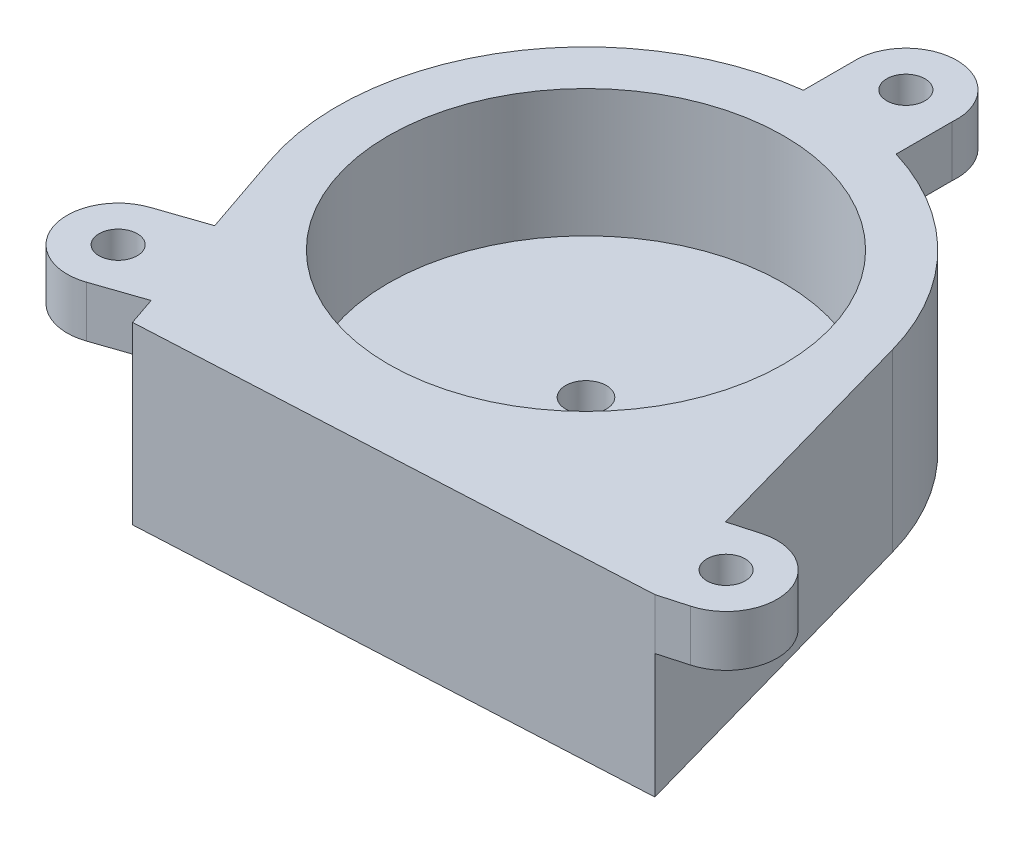
ISO-10303-21;
HEADER;
FILE_DESCRIPTION(('STEP AP214'),'2;1');
FILE_NAME('part.step','',(''),(''),'','','');
FILE_SCHEMA(('AUTOMOTIVE_DESIGN { 1 0 10303 214 1 1 1 1 }'));
ENDSEC;
DATA;
#1=APPLICATION_CONTEXT('core data for automotive mechanical design processes');
#2=APPLICATION_PROTOCOL_DEFINITION('international standard','automotive_design',2000,#1);
#3=PRODUCT_CONTEXT('',#1,'mechanical');
#4=PRODUCT('Part','Part','',(#3));
#5=PRODUCT_RELATED_PRODUCT_CATEGORY('part','',(#4));
#6=PRODUCT_DEFINITION_FORMATION('','',#4);
#7=PRODUCT_DEFINITION_CONTEXT('part definition',#1,'design');
#8=PRODUCT_DEFINITION('design','',#6,#7);
#9=PRODUCT_DEFINITION_SHAPE('','',#8);
#10=(LENGTH_UNIT() NAMED_UNIT(*) SI_UNIT(.MILLI.,.METRE.));
#11=(NAMED_UNIT(*) PLANE_ANGLE_UNIT() SI_UNIT($,.RADIAN.));
#12=(NAMED_UNIT(*) SI_UNIT($,.STERADIAN.) SOLID_ANGLE_UNIT());
#13=UNCERTAINTY_MEASURE_WITH_UNIT(LENGTH_MEASURE(1.E-05),#10,'distance_accuracy_value','');
#14=(GEOMETRIC_REPRESENTATION_CONTEXT(3) GLOBAL_UNCERTAINTY_ASSIGNED_CONTEXT((#13)) GLOBAL_UNIT_ASSIGNED_CONTEXT((#10,
#11,#12)) REPRESENTATION_CONTEXT('',''));
#15=CARTESIAN_POINT('',(0.,0.,0.));
#16=DIRECTION('',(0.,0.,1.));
#17=DIRECTION('',(1.,0.,0.));
#18=AXIS2_PLACEMENT_3D('',#15,#16,#17);
#19=CARTESIAN_POINT('',(0.,-6.254,0.));
#20=DIRECTION('',(0.,1.,0.));
#21=DIRECTION('',(0.,0.,1.));
#22=AXIS2_PLACEMENT_3D('',#19,#20,#21);
#23=CYLINDRICAL_SURFACE('',#22,1.6);
#24=CARTESIAN_POINT('',(0.,3.746,0.));
#25=DIRECTION('',(0.,1.,0.));
#26=DIRECTION('',(0.,0.,1.));
#27=AXIS2_PLACEMENT_3D('',#24,#25,#26);
#28=CIRCLE('',#27,1.6);
#29=CARTESIAN_POINT('',(0.,3.746,1.6));
#30=VERTEX_POINT('',#29);
#31=EDGE_CURVE('E382',#30,#30,#28,.T.);
#32=ORIENTED_EDGE('',*,*,#31,.T.);
#33=EDGE_LOOP('',(#32));
#34=FACE_BOUND('',#33,.T.);
#35=CARTESIAN_POINT('',(0.,0.746,0.));
#36=DIRECTION('',(0.,-1.,0.));
#37=DIRECTION('',(0.,0.,-1.));
#38=AXIS2_PLACEMENT_3D('',#35,#36,#37);
#39=CIRCLE('',#38,1.6);
#40=CARTESIAN_POINT('',(0.,0.746,-1.6));
#41=VERTEX_POINT('',#40);
#42=EDGE_CURVE('E42',#41,#41,#39,.F.);
#43=ORIENTED_EDGE('',*,*,#42,.F.);
#44=EDGE_LOOP('',(#43));
#45=FACE_BOUND('',#44,.T.);
#46=ADVANCED_FACE('F38',(#34,#45),#23,.F.);
#47=CARTESIAN_POINT('',(18.7686237282641,13.746,-5.29000178580058));
#48=DIRECTION('',(-0.962499402628868,0.,0.271283799625175));
#49=DIRECTION('',(0.271283799625175,0.,0.962499402628868));
#50=AXIS2_PLACEMENT_3D('',#47,#48,#49);
#51=PLANE('',#50);
#52=DIRECTION('',(0.,1.,0.));
#53=VECTOR('',#52,1.);
#54=CARTESIAN_POINT('',(23.921673943208,9.746,12.9927256032028));
#55=LINE('',#54,#53);
#56=CARTESIAN_POINT('',(23.921673943208,9.746,12.9927256032028));
#57=VERTEX_POINT('',#56);
#58=CARTESIAN_POINT('',(23.9216739432081,13.746,12.9927256032028));
#59=VERTEX_POINT('',#58);
#60=EDGE_CURVE('E348',#57,#59,#55,.T.);
#61=ORIENTED_EDGE('',*,*,#60,.F.);
#62=DIRECTION('',(-0.271283799625175,0.,-0.962499402628868));
#63=VECTOR('',#62,1.);
#64=CARTESIAN_POINT('',(18.7686237282641,9.746,-5.29000178580058));
#65=LINE('',#64,#63);
#66=CARTESIAN_POINT('',(26.0919443402095,9.746,20.6927208242338));
#67=VERTEX_POINT('',#66);
#68=EDGE_CURVE('E347',#67,#57,#65,.T.);
#69=ORIENTED_EDGE('',*,*,#68,.F.);
#70=DIRECTION('',(0.,-1.,0.));
#71=VECTOR('',#70,1.);
#72=CARTESIAN_POINT('',(26.0919443402095,13.746,20.6927208242338));
#73=LINE('',#72,#71);
#74=CARTESIAN_POINT('',(26.0919443402095,0.,20.6927208242338));
#75=VERTEX_POINT('',#74);
#76=EDGE_CURVE('E403',#67,#75,#73,.T.);
#77=ORIENTED_EDGE('',*,*,#76,.T.);
#78=DIRECTION('',(-0.271283799625175,0.,-0.962499402628868));
#79=VECTOR('',#78,1.);
#80=CARTESIAN_POINT('',(18.7686237282641,0.,-5.29000178580058));
#81=LINE('',#80,#79);
#82=CARTESIAN_POINT('',(18.7871117800502,0.,-5.22440723564889));
#83=VERTEX_POINT('',#82);
#84=EDGE_CURVE('E388',#75,#83,#81,.T.);
#85=ORIENTED_EDGE('',*,*,#84,.T.);
#86=DIRECTION('',(0.,-1.,0.));
#87=VECTOR('',#86,1.);
#88=CARTESIAN_POINT('',(18.7871117800502,13.746,-5.22440723564889));
#89=LINE('',#88,#87);
#90=CARTESIAN_POINT('',(18.7871117800502,13.746,-5.22440723564889));
#91=VERTEX_POINT('',#90);
#92=EDGE_CURVE('E328',#91,#83,#89,.T.);
#93=ORIENTED_EDGE('',*,*,#92,.F.);
#94=DIRECTION('',(-0.271283799625175,0.,-0.962499402628868));
#95=VECTOR('',#94,1.);
#96=CARTESIAN_POINT('',(18.7686237282641,13.746,-5.29000178580058));
#97=LINE('',#96,#95);
#98=EDGE_CURVE('E391',#59,#91,#97,.T.);
#99=ORIENTED_EDGE('',*,*,#98,.F.);
#100=EDGE_LOOP('',(#61,#69,#77,#85,#93,#99));
#101=FACE_BOUND('',#100,.T.);
#102=ADVANCED_FACE('F40',(#101),#51,.F.);
#103=CARTESIAN_POINT('',(0.,13.746,0.));
#104=DIRECTION('',(0.,-1.,0.));
#105=DIRECTION('',(0.,0.,-1.));
#106=AXIS2_PLACEMENT_3D('',#103,#104,#105);
#107=CYLINDRICAL_SURFACE('',#106,19.5);
#108=CARTESIAN_POINT('',(0.,9.746,0.));
#109=DIRECTION('',(0.,1.,0.));
#110=DIRECTION('',(0.,0.,1.));
#111=AXIS2_PLACEMENT_3D('',#108,#109,#110);
#112=CIRCLE('',#111,19.5);
#113=CARTESIAN_POINT('',(5.648,9.746,-18.6641393050952));
#114=VERTEX_POINT('',#113);
#115=CARTESIAN_POINT('',(-2.321,9.746,-19.361378024304));
#116=VERTEX_POINT('',#115);
#117=EDGE_CURVE('E247',#114,#116,#112,.T.);
#118=ORIENTED_EDGE('',*,*,#117,.F.);
#119=DIRECTION('',(0.,-1.,0.));
#120=VECTOR('',#119,1.);
#121=CARTESIAN_POINT('',(5.648,13.746,-18.6641393050952));
#122=LINE('',#121,#120);
#123=CARTESIAN_POINT('',(5.648,13.746,-18.6641393050952));
#124=VERTEX_POINT('',#123);
#125=EDGE_CURVE('E320',#114,#124,#122,.F.);
#126=ORIENTED_EDGE('',*,*,#125,.T.);
#127=CARTESIAN_POINT('',(0.,13.746,0.));
#128=DIRECTION('',(0.,1.,0.));
#129=DIRECTION('',(0.,0.,1.));
#130=AXIS2_PLACEMENT_3D('',#127,#128,#129);
#131=CIRCLE('',#130,19.5);
#132=EDGE_CURVE('E395',#91,#124,#131,.T.);
#133=ORIENTED_EDGE('',*,*,#132,.F.);
#134=ORIENTED_EDGE('',*,*,#92,.T.);
#135=CARTESIAN_POINT('',(0.,0.,0.));
#136=DIRECTION('',(0.,1.,0.));
#137=DIRECTION('',(0.,0.,1.));
#138=AXIS2_PLACEMENT_3D('',#135,#136,#137);
#139=CIRCLE('',#138,19.5);
#140=CARTESIAN_POINT('',(-18.4532154742646,0.,6.30308167965188));
#141=VERTEX_POINT('',#140);
#142=EDGE_CURVE('E406',#83,#141,#139,.T.);
#143=ORIENTED_EDGE('',*,*,#142,.T.);
#144=DIRECTION('',(0.,-1.,0.));
#145=VECTOR('',#144,1.);
#146=CARTESIAN_POINT('',(-18.4532154742646,13.746,6.30308167965188));
#147=LINE('',#146,#145);
#148=CARTESIAN_POINT('',(-18.4532154742646,13.746,6.30308167965188));
#149=VERTEX_POINT('',#148);
#150=EDGE_CURVE('E331',#149,#141,#147,.T.);
#151=ORIENTED_EDGE('',*,*,#150,.F.);
#152=CARTESIAN_POINT('',(-2.321,13.746,-19.361378024304));
#153=VERTEX_POINT('',#152);
#154=EDGE_CURVE('E393',#153,#149,#131,.T.);
#155=ORIENTED_EDGE('',*,*,#154,.F.);
#156=DIRECTION('',(0.,-1.,0.));
#157=VECTOR('',#156,1.);
#158=CARTESIAN_POINT('',(-2.321,13.746,-19.361378024304));
#159=LINE('',#158,#157);
#160=EDGE_CURVE('E324',#116,#153,#159,.F.);
#161=ORIENTED_EDGE('',*,*,#160,.F.);
#162=EDGE_LOOP('',(#118,#126,#133,#134,#143,#151,#155,#161));
#163=FACE_BOUND('',#162,.T.);
#164=ADVANCED_FACE('F282',(#163),#107,.T.);
#165=CARTESIAN_POINT('',(-18.4532154742646,13.746,6.30308167965187));
#166=DIRECTION('',(0.946318742269977,0.,-0.323234957930865));
#167=DIRECTION('',(-0.323234957930865,0.,-0.946318742269977));
#168=AXIS2_PLACEMENT_3D('',#165,#166,#167);
#169=PLANE('',#168);
#170=DIRECTION('',(0.323234957930865,0.,0.946318742269977));
#171=VECTOR('',#170,1.);
#172=CARTESIAN_POINT('',(-18.4532154742646,9.746,6.30308167965187));
#173=LINE('',#172,#171);
#174=CARTESIAN_POINT('',(-16.1996213475706,9.746,12.9008159507582));
#175=VERTEX_POINT('',#174);
#176=CARTESIAN_POINT('',(-13.6137416841236,9.746,20.471365888918));
#177=VERTEX_POINT('',#176);
#178=EDGE_CURVE('E447',#175,#177,#173,.T.);
#179=ORIENTED_EDGE('',*,*,#178,.F.);
#180=DIRECTION('',(0.,1.,0.));
#181=VECTOR('',#180,1.);
#182=CARTESIAN_POINT('',(-16.1996213475706,9.746,12.9008159507582));
#183=LINE('',#182,#181);
#184=CARTESIAN_POINT('',(-16.1996213475706,13.746,12.9008159507582));
#185=VERTEX_POINT('',#184);
#186=EDGE_CURVE('E443',#175,#185,#183,.T.);
#187=ORIENTED_EDGE('',*,*,#186,.T.);
#188=DIRECTION('',(0.323234957930865,0.,0.946318742269977));
#189=VECTOR('',#188,1.);
#190=CARTESIAN_POINT('',(-18.4532154742646,13.746,6.30308167965187));
#191=LINE('',#190,#189);
#192=EDGE_CURVE('E398',#149,#185,#191,.T.);
#193=ORIENTED_EDGE('',*,*,#192,.F.);
#194=ORIENTED_EDGE('',*,*,#150,.T.);
#195=DIRECTION('',(0.323234957930865,0.,0.946318742269977));
#196=VECTOR('',#195,1.);
#197=CARTESIAN_POINT('',(-18.4532154742646,0.,6.30308167965187));
#198=LINE('',#197,#196);
#199=CARTESIAN_POINT('',(-12.8570486476075,0.,22.686698064572));
#200=VERTEX_POINT('',#199);
#201=EDGE_CURVE('E408',#141,#200,#198,.T.);
#202=ORIENTED_EDGE('',*,*,#201,.T.);
#203=DIRECTION('',(0.,-1.,0.));
#204=VECTOR('',#203,1.);
#205=CARTESIAN_POINT('',(-12.8570486476075,13.746,22.686698064572));
#206=LINE('',#205,#204);
#207=CARTESIAN_POINT('',(-12.8570486476075,13.746,22.686698064572));
#208=VERTEX_POINT('',#207);
#209=EDGE_CURVE('E414',#208,#200,#206,.T.);
#210=ORIENTED_EDGE('',*,*,#209,.F.);
#211=CARTESIAN_POINT('',(-13.6137416841236,13.746,20.471365888918));
#212=VERTEX_POINT('',#211);
#213=EDGE_CURVE('E397',#212,#208,#191,.T.);
#214=ORIENTED_EDGE('',*,*,#213,.F.);
#215=DIRECTION('',(0.,1.,0.));
#216=VECTOR('',#215,1.);
#217=CARTESIAN_POINT('',(-13.6137416841236,9.746,20.471365888918));
#218=LINE('',#217,#216);
#219=EDGE_CURVE('E62',#177,#212,#218,.T.);
#220=ORIENTED_EDGE('',*,*,#219,.F.);
#221=EDGE_LOOP('',(#179,#187,#193,#194,#202,#210,#214,#220));
#222=FACE_BOUND('',#221,.T.);
#223=ADVANCED_FACE('F308',(#222),#169,.F.);
#224=CARTESIAN_POINT('',(1.12479113156714,13.746,21.9709036843052));
#225=DIRECTION('',(-0.0511276215471334,0.,-0.998692127892742));
#226=DIRECTION('',(-0.998692127892742,0.,0.0511276215471334));
#227=AXIS2_PLACEMENT_3D('',#224,#225,#226);
#228=PLANE('',#227);
#229=DIRECTION('',(0.998692127892742,0.,-0.0511276215471334));
#230=VECTOR('',#229,1.);
#231=CARTESIAN_POINT('',(1.12479113156714,0.,21.9709036843052));
#232=LINE('',#231,#230);
#233=EDGE_CURVE('E394',#200,#75,#232,.T.);
#234=ORIENTED_EDGE('',*,*,#233,.T.);
#235=ORIENTED_EDGE('',*,*,#76,.F.);
#236=CARTESIAN_POINT('',(26.0919443402095,13.746,20.6927208242338));
#237=VERTEX_POINT('',#236);
#238=EDGE_CURVE('E412',#237,#67,#73,.T.);
#239=ORIENTED_EDGE('',*,*,#238,.F.);
#240=DIRECTION('',(0.998692127892742,0.,-0.0511276215471334));
#241=VECTOR('',#240,1.);
#242=CARTESIAN_POINT('',(1.12479113156714,13.746,21.9709036843052));
#243=LINE('',#242,#241);
#244=EDGE_CURVE('E401',#208,#237,#243,.T.);
#245=ORIENTED_EDGE('',*,*,#244,.F.);
#246=ORIENTED_EDGE('',*,*,#209,.T.);
#247=EDGE_LOOP('',(#234,#235,#239,#245,#246));
#248=FACE_BOUND('',#247,.T.);
#249=ADVANCED_FACE('F301',(#248),#228,.F.);
#250=CARTESIAN_POINT('',(0.,13.746,0.));
#251=DIRECTION('',(0.,1.,0.));
#252=DIRECTION('',(0.,0.,1.));
#253=AXIS2_PLACEMENT_3D('',#250,#251,#252);
#254=PLANE('',#253);
#255=CARTESIAN_POINT('',(27.2044833489072,13.746,16.2233011053631));
#256=DIRECTION('',(0.,1.,0.));
#257=DIRECTION('',(0.,0.,1.));
#258=AXIS2_PLACEMENT_3D('',#255,#256,#257);
#259=CIRCLE('',#258,1.5);
#260=CARTESIAN_POINT('',(27.2044833489072,13.746,17.7233011053631));
#261=VERTEX_POINT('',#260);
#262=EDGE_CURVE('E178',#261,#261,#259,.T.);
#263=ORIENTED_EDGE('',*,*,#262,.F.);
#264=EDGE_LOOP('',(#263));
#265=FACE_BOUND('',#264,.T.);
#266=DIRECTION('',(0.265790638666016,0.,0.964030775648532));
#267=VECTOR('',#266,1.);
#268=CARTESIAN_POINT('',(25.5218092675974,13.746,10.1201907478643));
#269=LINE('',#268,#267);
#270=CARTESIAN_POINT('',(26.1413035069811,13.746,12.3671153013408));
#271=VERTEX_POINT('',#270);
#272=CARTESIAN_POINT('',(26.1413207942431,13.746,12.3671780027689));
#273=VERTEX_POINT('',#272);
#274=EDGE_CURVE('E161',#271,#273,#269,.T.);
#275=ORIENTED_EDGE('',*,*,#274,.F.);
#276=DIRECTION('',(0.962499402628869,0.,-0.271283799625172));
#277=VECTOR('',#276,1.);
#278=CARTESIAN_POINT('',(5.15305021494386,13.746,18.2827273890034));
#279=LINE('',#278,#277);
#280=EDGE_CURVE('E338',#59,#271,#279,.T.);
#281=ORIENTED_EDGE('',*,*,#280,.F.);
#282=ORIENTED_EDGE('',*,*,#98,.T.);
#283=ORIENTED_EDGE('',*,*,#132,.T.);
#284=DIRECTION('',(0.,0.,-1.));
#285=VECTOR('',#284,1.);
#286=CARTESIAN_POINT('',(5.648,13.746,0.));
#287=LINE('',#286,#285);
#288=CARTESIAN_POINT('',(5.648,13.746,-23.062));
#289=VERTEX_POINT('',#288);
#290=EDGE_CURVE('E369',#124,#289,#287,.T.);
#291=ORIENTED_EDGE('',*,*,#290,.T.);
#292=CARTESIAN_POINT('',(1.6635,13.746,-23.4105));
#293=DIRECTION('',(0.,1.,0.));
#294=DIRECTION('',(0.,0.,1.));
#295=AXIS2_PLACEMENT_3D('',#292,#293,#294);
#296=CIRCLE('',#295,3.99971155209973);
#297=CARTESIAN_POINT('',(-2.321,13.746,-23.759));
#298=VERTEX_POINT('',#297);
#299=EDGE_CURVE('E371',#289,#298,#296,.T.);
#300=ORIENTED_EDGE('',*,*,#299,.T.);
#301=DIRECTION('',(0.,0.,-1.));
#302=VECTOR('',#301,1.);
#303=CARTESIAN_POINT('',(-2.321,13.746,0.));
#304=LINE('',#303,#302);
#305=EDGE_CURVE('E359',#153,#298,#304,.T.);
#306=ORIENTED_EDGE('',*,*,#305,.F.);
#307=ORIENTED_EDGE('',*,*,#154,.T.);
#308=ORIENTED_EDGE('',*,*,#192,.T.);
#309=DIRECTION('',(-0.946318742269976,0.,0.323234957930869));
#310=VECTOR('',#309,1.);
#311=CARTESIAN_POINT('',(2.25359412669399,13.746,6.59773427110619));
#312=LINE('',#311,#310);
#313=CARTESIAN_POINT('',(-19.9848963166504,13.746,14.1937557824816));
#314=VERTEX_POINT('',#313);
#315=EDGE_CURVE('E439',#185,#314,#312,.T.);
#316=ORIENTED_EDGE('',*,*,#315,.T.);
#317=CARTESIAN_POINT('',(-18.691956484927,13.746,17.9790307515615));
#318=DIRECTION('',(0.,1.,0.));
#319=DIRECTION('',(0.,0.,1.));
#320=AXIS2_PLACEMENT_3D('',#317,#318,#319);
#321=CIRCLE('',#320,3.99999999999999);
#322=CARTESIAN_POINT('',(-17.3990166532036,13.746,21.7643057206414));
#323=VERTEX_POINT('',#322);
#324=EDGE_CURVE('E434',#314,#323,#321,.T.);
#325=ORIENTED_EDGE('',*,*,#324,.T.);
#326=DIRECTION('',(-0.946318742269978,0.,0.323234957930865));
#327=VECTOR('',#326,1.);
#328=CARTESIAN_POINT('',(4.83947379014091,13.746,14.1682842092661));
#329=LINE('',#328,#327);
#330=EDGE_CURVE('E431',#212,#323,#329,.T.);
#331=ORIENTED_EDGE('',*,*,#330,.F.);
#332=ORIENTED_EDGE('',*,*,#213,.T.);
#333=ORIENTED_EDGE('',*,*,#244,.T.);
#334=DIRECTION('',(0.962499402628868,0.,-0.271283799625177));
#335=VECTOR('',#334,1.);
#336=CARTESIAN_POINT('',(7.3233206119454,13.746,25.9827226100344));
#337=LINE('',#336,#335);
#338=CARTESIAN_POINT('',(28.2676545472023,13.746,20.0794555586713));
#339=VERTEX_POINT('',#338);
#340=EDGE_CURVE('E164',#237,#339,#337,.T.);
#341=ORIENTED_EDGE('',*,*,#340,.T.);
#342=CARTESIAN_POINT('',(27.2044833489072,13.746,16.2233011053631));
#343=DIRECTION('',(0.,1.,0.));
#344=DIRECTION('',(0.,0.,1.));
#345=AXIS2_PLACEMENT_3D('',#342,#343,#344);
#346=CIRCLE('',#345,4.00000000000003);
#347=EDGE_CURVE('E157',#273,#339,#346,.F.);
#348=ORIENTED_EDGE('',*,*,#347,.F.);
#349=EDGE_LOOP('',(#275,#281,#282,#283,#291,#300,#306,#307,#308,#316,#325,#331,#332,#333,#341,#348));
#350=FACE_BOUND('',#349,.T.);
#351=CARTESIAN_POINT('',(0.,13.746,0.));
#352=DIRECTION('',(0.,1.,0.));
#353=DIRECTION('',(0.,0.,1.));
#354=AXIS2_PLACEMENT_3D('',#351,#352,#353);
#355=CIRCLE('',#354,15.5);
#356=CARTESIAN_POINT('',(0.,13.746,15.5));
#357=VERTEX_POINT('',#356);
#358=EDGE_CURVE('E384',#357,#357,#355,.T.);
#359=ORIENTED_EDGE('',*,*,#358,.F.);
#360=EDGE_LOOP('',(#359));
#361=FACE_BOUND('',#360,.T.);
#362=CARTESIAN_POINT('',(1.6635,13.746,-23.4105));
#363=DIRECTION('',(0.,1.,0.));
#364=DIRECTION('',(0.,0.,1.));
#365=AXIS2_PLACEMENT_3D('',#362,#363,#364);
#366=CIRCLE('',#365,1.5);
#367=CARTESIAN_POINT('',(1.6635,13.746,-21.9105));
#368=VERTEX_POINT('',#367);
#369=EDGE_CURVE('E354',#368,#368,#366,.T.);
#370=ORIENTED_EDGE('',*,*,#369,.F.);
#371=EDGE_LOOP('',(#370));
#372=FACE_BOUND('',#371,.T.);
#373=CARTESIAN_POINT('',(-18.691956484927,13.746,17.9790307515615));
#374=DIRECTION('',(0.,1.,0.));
#375=DIRECTION('',(0.,0.,1.));
#376=AXIS2_PLACEMENT_3D('',#373,#374,#375);
#377=CIRCLE('',#376,1.5);
#378=CARTESIAN_POINT('',(-18.691956484927,13.746,19.4790307515615));
#379=VERTEX_POINT('',#378);
#380=EDGE_CURVE('E182',#379,#379,#377,.T.);
#381=ORIENTED_EDGE('',*,*,#380,.F.);
#382=EDGE_LOOP('',(#381));
#383=FACE_BOUND('',#382,.T.);
#384=ADVANCED_FACE('F158',(#265,#350,#361,#372,#383),#254,.T.);
#385=CARTESIAN_POINT('',(0.,0.,0.));
#386=DIRECTION('',(0.,1.,0.));
#387=DIRECTION('',(0.,0.,1.));
#388=AXIS2_PLACEMENT_3D('',#385,#386,#387);
#389=PLANE('',#388);
#390=CARTESIAN_POINT('',(0.,0.,0.));
#391=DIRECTION('',(0.,-1.,0.));
#392=DIRECTION('',(0.,0.,-1.));
#393=AXIS2_PLACEMENT_3D('',#390,#391,#392);
#394=CIRCLE('',#393,4.);
#395=CARTESIAN_POINT('',(0.,0.,-4.));
#396=VERTEX_POINT('',#395);
#397=EDGE_CURVE('E264',#396,#396,#394,.T.);
#398=ORIENTED_EDGE('',*,*,#397,.F.);
#399=EDGE_LOOP('',(#398));
#400=FACE_BOUND('',#399,.T.);
#401=CARTESIAN_POINT('',(7.54960822195559,0.,17.6367495482952));
#402=DIRECTION('',(0.,-1.,0.));
#403=DIRECTION('',(0.,0.,-1.));
#404=AXIS2_PLACEMENT_3D('',#401,#402,#403);
#405=CIRCLE('',#404,2.05);
#406=CARTESIAN_POINT('',(7.54960822195559,0.,15.5867495482952));
#407=VERTEX_POINT('',#406);
#408=EDGE_CURVE('E258',#407,#407,#405,.T.);
#409=ORIENTED_EDGE('',*,*,#408,.F.);
#410=EDGE_LOOP('',(#409));
#411=FACE_BOUND('',#410,.T.);
#412=ORIENTED_EDGE('',*,*,#84,.F.);
#413=ORIENTED_EDGE('',*,*,#233,.F.);
#414=ORIENTED_EDGE('',*,*,#201,.F.);
#415=ORIENTED_EDGE('',*,*,#142,.F.);
#416=EDGE_LOOP('',(#412,#413,#414,#415));
#417=FACE_BOUND('',#416,.T.);
#418=ADVANCED_FACE('F297',(#400,#411,#417),#389,.F.);
#419=CARTESIAN_POINT('',(0.,3.746,0.));
#420=DIRECTION('',(0.,1.,0.));
#421=DIRECTION('',(0.,0.,1.));
#422=AXIS2_PLACEMENT_3D('',#419,#420,#421);
#423=CYLINDRICAL_SURFACE('',#422,15.5);
#424=CARTESIAN_POINT('',(0.,3.746,0.));
#425=DIRECTION('',(0.,1.,0.));
#426=DIRECTION('',(0.,0.,1.));
#427=AXIS2_PLACEMENT_3D('',#424,#425,#426);
#428=CIRCLE('',#427,15.5);
#429=CARTESIAN_POINT('',(0.,3.746,15.5));
#430=VERTEX_POINT('',#429);
#431=EDGE_CURVE('E385',#430,#430,#428,.T.);
#432=ORIENTED_EDGE('',*,*,#431,.F.);
#433=EDGE_LOOP('',(#432));
#434=FACE_BOUND('',#433,.T.);
#435=ORIENTED_EDGE('',*,*,#358,.T.);
#436=EDGE_LOOP('',(#435));
#437=FACE_BOUND('',#436,.T.);
#438=ADVANCED_FACE('F293',(#434,#437),#423,.F.);
#439=CARTESIAN_POINT('',(0.,3.746,0.));
#440=DIRECTION('',(0.,1.,0.));
#441=DIRECTION('',(0.,0.,1.));
#442=AXIS2_PLACEMENT_3D('',#439,#440,#441);
#443=PLANE('',#442);
#444=ORIENTED_EDGE('',*,*,#31,.F.);
#445=EDGE_LOOP('',(#444));
#446=FACE_BOUND('',#445,.T.);
#447=ORIENTED_EDGE('',*,*,#431,.T.);
#448=EDGE_LOOP('',(#447));
#449=FACE_BOUND('',#448,.T.);
#450=ADVANCED_FACE('F289',(#446,#449),#443,.T.);
#451=CARTESIAN_POINT('',(5.648,9.746,0.));
#452=DIRECTION('',(1.,0.,0.));
#453=DIRECTION('',(0.,0.,-1.));
#454=AXIS2_PLACEMENT_3D('',#451,#452,#453);
#455=PLANE('',#454);
#456=ORIENTED_EDGE('',*,*,#125,.F.);
#457=DIRECTION('',(0.,0.,-1.));
#458=VECTOR('',#457,1.);
#459=CARTESIAN_POINT('',(5.648,9.746,0.));
#460=LINE('',#459,#458);
#461=CARTESIAN_POINT('',(5.648,9.746,-23.062));
#462=VERTEX_POINT('',#461);
#463=EDGE_CURVE('E358',#114,#462,#460,.T.);
#464=ORIENTED_EDGE('',*,*,#463,.T.);
#465=DIRECTION('',(0.,1.,0.));
#466=VECTOR('',#465,1.);
#467=CARTESIAN_POINT('',(5.648,9.746,-23.062));
#468=LINE('',#467,#466);
#469=EDGE_CURVE('E366',#462,#289,#468,.T.);
#470=ORIENTED_EDGE('',*,*,#469,.T.);
#471=ORIENTED_EDGE('',*,*,#290,.F.);
#472=EDGE_LOOP('',(#456,#464,#470,#471));
#473=FACE_BOUND('',#472,.T.);
#474=ADVANCED_FACE('F292',(#473),#455,.T.);
#475=CARTESIAN_POINT('',(-2.321,9.746,0.));
#476=DIRECTION('',(1.,0.,0.));
#477=DIRECTION('',(0.,0.,-1.));
#478=AXIS2_PLACEMENT_3D('',#475,#476,#477);
#479=PLANE('',#478);
#480=DIRECTION('',(0.,0.,-1.));
#481=VECTOR('',#480,1.);
#482=CARTESIAN_POINT('',(-2.321,9.746,0.));
#483=LINE('',#482,#481);
#484=CARTESIAN_POINT('',(-2.321,9.746,-23.759));
#485=VERTEX_POINT('',#484);
#486=EDGE_CURVE('E364',#116,#485,#483,.T.);
#487=ORIENTED_EDGE('',*,*,#486,.F.);
#488=ORIENTED_EDGE('',*,*,#160,.T.);
#489=ORIENTED_EDGE('',*,*,#305,.T.);
#490=DIRECTION('',(0.,1.,0.));
#491=VECTOR('',#490,1.);
#492=CARTESIAN_POINT('',(-2.321,9.746,-23.759));
#493=LINE('',#492,#491);
#494=EDGE_CURVE('E375',#485,#298,#493,.T.);
#495=ORIENTED_EDGE('',*,*,#494,.F.);
#496=EDGE_LOOP('',(#487,#488,#489,#495));
#497=FACE_BOUND('',#496,.T.);
#498=ADVANCED_FACE('F463',(#497),#479,.F.);
#499=CARTESIAN_POINT('',(1.6635,9.746,-23.4105));
#500=DIRECTION('',(0.,1.,0.));
#501=DIRECTION('',(0.,0.,1.));
#502=AXIS2_PLACEMENT_3D('',#499,#500,#501);
#503=CYLINDRICAL_SURFACE('',#502,1.5);
#504=CARTESIAN_POINT('',(1.6635,9.746,-23.4105));
#505=DIRECTION('',(0.,1.,0.));
#506=DIRECTION('',(0.,0.,1.));
#507=AXIS2_PLACEMENT_3D('',#504,#505,#506);
#508=CIRCLE('',#507,1.5);
#509=CARTESIAN_POINT('',(1.6635,9.746,-21.9105));
#510=VERTEX_POINT('',#509);
#511=EDGE_CURVE('E355',#510,#510,#508,.T.);
#512=ORIENTED_EDGE('',*,*,#511,.F.);
#513=EDGE_LOOP('',(#512));
#514=FACE_BOUND('',#513,.T.);
#515=ORIENTED_EDGE('',*,*,#369,.T.);
#516=EDGE_LOOP('',(#515));
#517=FACE_BOUND('',#516,.T.);
#518=ADVANCED_FACE('F287',(#514,#517),#503,.F.);
#519=CARTESIAN_POINT('',(1.6635,9.746,-23.4105));
#520=DIRECTION('',(0.,1.,0.));
#521=DIRECTION('',(0.,0.,1.));
#522=AXIS2_PLACEMENT_3D('',#519,#520,#521);
#523=CYLINDRICAL_SURFACE('',#522,3.99971155209973);
#524=ORIENTED_EDGE('',*,*,#299,.F.);
#525=ORIENTED_EDGE('',*,*,#469,.F.);
#526=CARTESIAN_POINT('',(1.6635,9.746,-23.4105));
#527=DIRECTION('',(0.,1.,0.));
#528=DIRECTION('',(0.,0.,1.));
#529=AXIS2_PLACEMENT_3D('',#526,#527,#528);
#530=CIRCLE('',#529,3.99971155209973);
#531=EDGE_CURVE('E361',#462,#485,#530,.T.);
#532=ORIENTED_EDGE('',*,*,#531,.T.);
#533=ORIENTED_EDGE('',*,*,#494,.T.);
#534=EDGE_LOOP('',(#524,#525,#532,#533));
#535=FACE_BOUND('',#534,.T.);
#536=ADVANCED_FACE('F467',(#535),#523,.T.);
#537=CARTESIAN_POINT('',(0.,9.746,0.));
#538=DIRECTION('',(0.,1.,0.));
#539=DIRECTION('',(0.,0.,1.));
#540=AXIS2_PLACEMENT_3D('',#537,#538,#539);
#541=PLANE('',#540);
#542=ORIENTED_EDGE('',*,*,#511,.T.);
#543=EDGE_LOOP('',(#542));
#544=FACE_BOUND('',#543,.T.);
#545=ORIENTED_EDGE('',*,*,#463,.F.);
#546=ORIENTED_EDGE('',*,*,#117,.T.);
#547=ORIENTED_EDGE('',*,*,#486,.T.);
#548=ORIENTED_EDGE('',*,*,#531,.F.);
#549=EDGE_LOOP('',(#545,#546,#547,#548));
#550=FACE_BOUND('',#549,.T.);
#551=ADVANCED_FACE('F232',(#544,#550),#541,.F.);
#552=CARTESIAN_POINT('',(7.3233206119454,9.746,25.9827226100344));
#553=DIRECTION('',(0.271283799625177,0.,0.962499402628868));
#554=DIRECTION('',(0.962499402628868,0.,-0.271283799625177));
#555=AXIS2_PLACEMENT_3D('',#552,#553,#554);
#556=PLANE('',#555);
#557=CARTESIAN_POINT('',(28.2676631908333,9.746,20.0794869093854));
#558=DIRECTION('',(0.,1.,0.));
#559=VECTOR('',#558,1.);
#560=LINE('',#557,#559);
#561=CARTESIAN_POINT('',(28.2676545472023,9.746,20.0794555586713));
#562=VERTEX_POINT('',#561);
#563=EDGE_CURVE('E171',#562,#339,#560,.T.);
#564=ORIENTED_EDGE('',*,*,#563,.T.);
#565=ORIENTED_EDGE('',*,*,#340,.F.);
#566=ORIENTED_EDGE('',*,*,#238,.T.);
#567=DIRECTION('',(0.962499402628868,0.,-0.271283799625177));
#568=VECTOR('',#567,1.);
#569=CARTESIAN_POINT('',(7.3233206119454,9.746,25.9827226100344));
#570=LINE('',#569,#568);
#571=EDGE_CURVE('E335',#67,#562,#570,.T.);
#572=ORIENTED_EDGE('',*,*,#571,.T.);
#573=EDGE_LOOP('',(#564,#565,#566,#572));
#574=FACE_BOUND('',#573,.T.);
#575=ADVANCED_FACE('F227',(#574),#556,.T.);
#576=CARTESIAN_POINT('',(5.15305021494386,9.746,18.2827273890034));
#577=DIRECTION('',(0.271283799625172,0.,0.962499402628869));
#578=DIRECTION('',(0.962499402628869,0.,-0.271283799625172));
#579=AXIS2_PLACEMENT_3D('',#576,#577,#578);
#580=PLANE('',#579);
#581=ORIENTED_EDGE('',*,*,#280,.T.);
#582=DIRECTION('',(0.,-1.,0.));
#583=VECTOR('',#582,1.);
#584=CARTESIAN_POINT('',(26.1413035069811,9.746,12.3671153013408));
#585=LINE('',#584,#583);
#586=CARTESIAN_POINT('',(26.1413035069811,9.746,12.3671153013408));
#587=VERTEX_POINT('',#586);
#588=EDGE_CURVE('E175',#271,#587,#585,.T.);
#589=ORIENTED_EDGE('',*,*,#588,.T.);
#590=DIRECTION('',(0.962499402628869,0.,-0.271283799625172));
#591=VECTOR('',#590,1.);
#592=CARTESIAN_POINT('',(5.15305021494386,9.746,18.2827273890034));
#593=LINE('',#592,#591);
#594=EDGE_CURVE('E337',#57,#587,#593,.T.);
#595=ORIENTED_EDGE('',*,*,#594,.F.);
#596=ORIENTED_EDGE('',*,*,#60,.T.);
#597=EDGE_LOOP('',(#581,#589,#595,#596));
#598=FACE_BOUND('',#597,.T.);
#599=ADVANCED_FACE('F223',(#598),#580,.F.);
#600=CARTESIAN_POINT('',(0.,9.746,0.));
#601=DIRECTION('',(0.,1.,0.));
#602=DIRECTION('',(0.,0.,1.));
#603=AXIS2_PLACEMENT_3D('',#600,#601,#602);
#604=PLANE('',#603);
#605=CARTESIAN_POINT('',(27.2044833489072,9.746,16.2233011053631));
#606=DIRECTION('',(0.,1.,0.));
#607=DIRECTION('',(0.,0.,1.));
#608=AXIS2_PLACEMENT_3D('',#605,#606,#607);
#609=CIRCLE('',#608,1.5);
#610=CARTESIAN_POINT('',(27.2044833489072,9.746,17.7233011053631));
#611=VERTEX_POINT('',#610);
#612=EDGE_CURVE('E166',#611,#611,#609,.T.);
#613=ORIENTED_EDGE('',*,*,#612,.T.);
#614=EDGE_LOOP('',(#613));
#615=FACE_BOUND('',#614,.T.);
#616=ORIENTED_EDGE('',*,*,#594,.T.);
#617=DIRECTION('',(0.265790638666016,0.,0.964030775648533));
#618=VECTOR('',#617,1.);
#619=CARTESIAN_POINT('',(21.1257295637684,9.746,-5.82452479202456));
#620=LINE('',#619,#618);
#621=CARTESIAN_POINT('',(26.1413207942431,9.746,12.3671780027689));
#622=VERTEX_POINT('',#621);
#623=EDGE_CURVE('E11',#587,#622,#620,.T.);
#624=ORIENTED_EDGE('',*,*,#623,.T.);
#625=CARTESIAN_POINT('',(27.2044833489072,9.746,16.2233011053631));
#626=DIRECTION('',(0.,1.,0.));
#627=DIRECTION('',(0.,0.,1.));
#628=AXIS2_PLACEMENT_3D('',#625,#626,#627);
#629=CIRCLE('',#628,4.00000000000003);
#630=EDGE_CURVE('E47',#562,#622,#629,.T.);
#631=ORIENTED_EDGE('',*,*,#630,.F.);
#632=ORIENTED_EDGE('',*,*,#571,.F.);
#633=ORIENTED_EDGE('',*,*,#68,.T.);
#634=EDGE_LOOP('',(#616,#624,#631,#632,#633));
#635=FACE_BOUND('',#634,.T.);
#636=ADVANCED_FACE('F216',(#615,#635),#604,.F.);
#637=CARTESIAN_POINT('',(2.25359412669399,9.746,6.59773427110619));
#638=DIRECTION('',(-0.323234957930869,0.,-0.946318742269976));
#639=DIRECTION('',(-0.946318742269976,0.,0.323234957930869));
#640=AXIS2_PLACEMENT_3D('',#637,#638,#639);
#641=PLANE('',#640);
#642=ORIENTED_EDGE('',*,*,#315,.F.);
#643=ORIENTED_EDGE('',*,*,#186,.F.);
#644=DIRECTION('',(-0.946318742269976,0.,0.323234957930869));
#645=VECTOR('',#644,1.);
#646=CARTESIAN_POINT('',(2.25359412669399,9.746,6.59773427110619));
#647=LINE('',#646,#645);
#648=CARTESIAN_POINT('',(-19.9848963166504,9.746,14.1937557824816));
#649=VERTEX_POINT('',#648);
#650=EDGE_CURVE('E438',#175,#649,#647,.T.);
#651=ORIENTED_EDGE('',*,*,#650,.T.);
#652=DIRECTION('',(0.,1.,0.));
#653=VECTOR('',#652,1.);
#654=CARTESIAN_POINT('',(-19.9848963166504,9.746,14.1937557824816));
#655=LINE('',#654,#653);
#656=EDGE_CURVE('E343',#649,#314,#655,.T.);
#657=ORIENTED_EDGE('',*,*,#656,.T.);
#658=EDGE_LOOP('',(#642,#643,#651,#657));
#659=FACE_BOUND('',#658,.T.);
#660=ADVANCED_FACE('F210',(#659),#641,.T.);
#661=CARTESIAN_POINT('',(4.83947379014091,9.746,14.1682842092661));
#662=DIRECTION('',(-0.323234957930865,0.,-0.946318742269978));
#663=DIRECTION('',(-0.946318742269978,0.,0.323234957930865));
#664=AXIS2_PLACEMENT_3D('',#661,#662,#663);
#665=PLANE('',#664);
#666=ORIENTED_EDGE('',*,*,#330,.T.);
#667=DIRECTION('',(0.,1.,0.));
#668=VECTOR('',#667,1.);
#669=CARTESIAN_POINT('',(-17.3990166532036,9.746,21.7643057206414));
#670=LINE('',#669,#668);
#671=CARTESIAN_POINT('',(-17.3990166532036,9.746,21.7643057206414));
#672=VERTEX_POINT('',#671);
#673=EDGE_CURVE('E445',#672,#323,#670,.T.);
#674=ORIENTED_EDGE('',*,*,#673,.F.);
#675=DIRECTION('',(-0.946318742269978,0.,0.323234957930865));
#676=VECTOR('',#675,1.);
#677=CARTESIAN_POINT('',(4.83947379014091,9.746,14.1682842092661));
#678=LINE('',#677,#676);
#679=EDGE_CURVE('E450',#177,#672,#678,.T.);
#680=ORIENTED_EDGE('',*,*,#679,.F.);
#681=ORIENTED_EDGE('',*,*,#219,.T.);
#682=EDGE_LOOP('',(#666,#674,#680,#681));
#683=FACE_BOUND('',#682,.T.);
#684=ADVANCED_FACE('F206',(#683),#665,.F.);
#685=CARTESIAN_POINT('',(-18.691956484927,9.746,17.9790307515615));
#686=DIRECTION('',(0.,1.,0.));
#687=DIRECTION('',(0.,0.,1.));
#688=AXIS2_PLACEMENT_3D('',#685,#686,#687);
#689=CYLINDRICAL_SURFACE('',#688,1.5);
#690=CARTESIAN_POINT('',(-18.691956484927,9.746,17.9790307515615));
#691=DIRECTION('',(0.,1.,0.));
#692=DIRECTION('',(0.,0.,1.));
#693=AXIS2_PLACEMENT_3D('',#690,#691,#692);
#694=CIRCLE('',#693,1.5);
#695=CARTESIAN_POINT('',(-18.691956484927,9.746,19.4790307515615));
#696=VERTEX_POINT('',#695);
#697=EDGE_CURVE('E189',#696,#696,#694,.T.);
#698=ORIENTED_EDGE('',*,*,#697,.F.);
#699=EDGE_LOOP('',(#698));
#700=FACE_BOUND('',#699,.T.);
#701=ORIENTED_EDGE('',*,*,#380,.T.);
#702=EDGE_LOOP('',(#701));
#703=FACE_BOUND('',#702,.T.);
#704=ADVANCED_FACE('F209',(#700,#703),#689,.F.);
#705=CARTESIAN_POINT('',(-18.691956484927,9.746,17.9790307515615));
#706=DIRECTION('',(0.,1.,0.));
#707=DIRECTION('',(0.,0.,1.));
#708=AXIS2_PLACEMENT_3D('',#705,#706,#707);
#709=CYLINDRICAL_SURFACE('',#708,3.99999999999999);
#710=ORIENTED_EDGE('',*,*,#324,.F.);
#711=ORIENTED_EDGE('',*,*,#656,.F.);
#712=CARTESIAN_POINT('',(-18.691956484927,9.746,17.9790307515615));
#713=DIRECTION('',(0.,1.,0.));
#714=DIRECTION('',(0.,0.,1.));
#715=AXIS2_PLACEMENT_3D('',#712,#713,#714);
#716=CIRCLE('',#715,3.99999999999999);
#717=EDGE_CURVE('E454',#649,#672,#716,.T.);
#718=ORIENTED_EDGE('',*,*,#717,.T.);
#719=ORIENTED_EDGE('',*,*,#673,.T.);
#720=EDGE_LOOP('',(#710,#711,#718,#719));
#721=FACE_BOUND('',#720,.T.);
#722=ADVANCED_FACE('F204',(#721),#709,.T.);
#723=CARTESIAN_POINT('',(0.,9.746,0.));
#724=DIRECTION('',(0.,1.,0.));
#725=DIRECTION('',(0.,0.,1.));
#726=AXIS2_PLACEMENT_3D('',#723,#724,#725);
#727=PLANE('',#726);
#728=ORIENTED_EDGE('',*,*,#697,.T.);
#729=EDGE_LOOP('',(#728));
#730=FACE_BOUND('',#729,.T.);
#731=ORIENTED_EDGE('',*,*,#650,.F.);
#732=ORIENTED_EDGE('',*,*,#178,.T.);
#733=ORIENTED_EDGE('',*,*,#679,.T.);
#734=ORIENTED_EDGE('',*,*,#717,.F.);
#735=EDGE_LOOP('',(#731,#732,#733,#734));
#736=FACE_BOUND('',#735,.T.);
#737=ADVANCED_FACE('F200',(#730,#736),#727,.F.);
#738=CARTESIAN_POINT('',(27.2044833489072,0.,16.2233011053631));
#739=DIRECTION('',(0.,1.,0.));
#740=DIRECTION('',(0.,0.,1.));
#741=AXIS2_PLACEMENT_3D('',#738,#739,#740);
#742=CYLINDRICAL_SURFACE('',#741,4.00000000000003);
#743=ORIENTED_EDGE('',*,*,#347,.T.);
#744=ORIENTED_EDGE('',*,*,#563,.F.);
#745=ORIENTED_EDGE('',*,*,#630,.T.);
#746=DIRECTION('',(0.,1.,0.));
#747=VECTOR('',#746,1.);
#748=CARTESIAN_POINT('',(26.1413207942431,0.,12.3671780027689));
#749=LINE('',#748,#747);
#750=EDGE_CURVE('E168',#622,#273,#749,.T.);
#751=ORIENTED_EDGE('',*,*,#750,.T.);
#752=EDGE_LOOP('',(#743,#744,#745,#751));
#753=FACE_BOUND('',#752,.T.);
#754=ADVANCED_FACE('F169',(#753),#742,.T.);
#755=CARTESIAN_POINT('',(25.5218092675974,0.,10.1201907478643));
#756=DIRECTION('',(-0.964030775648532,0.,0.265790638666016));
#757=DIRECTION('',(0.265790638666016,0.,0.964030775648533));
#758=AXIS2_PLACEMENT_3D('',#755,#756,#757);
#759=PLANE('',#758);
#760=ORIENTED_EDGE('',*,*,#274,.T.);
#761=ORIENTED_EDGE('',*,*,#750,.F.);
#762=ORIENTED_EDGE('',*,*,#623,.F.);
#763=ORIENTED_EDGE('',*,*,#588,.F.);
#764=EDGE_LOOP('',(#760,#761,#762,#763));
#765=FACE_BOUND('',#764,.T.);
#766=ADVANCED_FACE('F173',(#765),#759,.F.);
#767=CARTESIAN_POINT('',(27.2044833489072,0.,16.2233011053631));
#768=DIRECTION('',(0.,1.,0.));
#769=DIRECTION('',(0.,0.,1.));
#770=AXIS2_PLACEMENT_3D('',#767,#768,#769);
#771=CYLINDRICAL_SURFACE('',#770,1.5);
#772=ORIENTED_EDGE('',*,*,#262,.T.);
#773=EDGE_LOOP('',(#772));
#774=FACE_BOUND('',#773,.T.);
#775=ORIENTED_EDGE('',*,*,#612,.F.);
#776=EDGE_LOOP('',(#775));
#777=FACE_BOUND('',#776,.T.);
#778=ADVANCED_FACE('F573',(#774,#777),#771,.F.);
#779=CARTESIAN_POINT('',(7.54960822195559,6.,17.6367495482952));
#780=DIRECTION('',(0.,-1.,0.));
#781=DIRECTION('',(0.,0.,-1.));
#782=AXIS2_PLACEMENT_3D('',#779,#780,#781);
#783=CYLINDRICAL_SURFACE('',#782,2.05);
#784=CARTESIAN_POINT('',(7.54960822195559,6.,17.6367495482952));
#785=DIRECTION('',(0.,-1.,0.));
#786=DIRECTION('',(0.,0.,-1.));
#787=AXIS2_PLACEMENT_3D('',#784,#785,#786);
#788=CIRCLE('',#787,2.05);
#789=CARTESIAN_POINT('',(7.54960822195559,6.,15.5867495482952));
#790=VERTEX_POINT('',#789);
#791=EDGE_CURVE('E254',#790,#790,#788,.T.);
#792=ORIENTED_EDGE('',*,*,#791,.F.);
#793=EDGE_LOOP('',(#792));
#794=FACE_BOUND('',#793,.T.);
#795=ORIENTED_EDGE('',*,*,#408,.T.);
#796=EDGE_LOOP('',(#795));
#797=FACE_BOUND('',#796,.T.);
#798=ADVANCED_FACE('F578',(#794,#797),#783,.F.);
#799=CARTESIAN_POINT('',(7.54960822195559,6.,17.6367495482952));
#800=DIRECTION('',(0.,-1.,0.));
#801=DIRECTION('',(0.,0.,-1.));
#802=AXIS2_PLACEMENT_3D('',#799,#800,#801);
#803=PLANE('',#802);
#804=ORIENTED_EDGE('',*,*,#791,.T.);
#805=EDGE_LOOP('',(#804));
#806=FACE_BOUND('',#805,.T.);
#807=ADVANCED_FACE('F586',(#806),#803,.T.);
#808=CARTESIAN_POINT('',(0.,0.746,0.));
#809=DIRECTION('',(0.,-1.,0.));
#810=DIRECTION('',(0.,0.,-1.));
#811=AXIS2_PLACEMENT_3D('',#808,#809,#810);
#812=PLANE('',#811);
#813=CARTESIAN_POINT('',(0.,0.746,0.));
#814=DIRECTION('',(0.,-1.,0.));
#815=DIRECTION('',(0.,0.,-1.));
#816=AXIS2_PLACEMENT_3D('',#813,#814,#815);
#817=CIRCLE('',#816,4.);
#818=CARTESIAN_POINT('',(0.,0.746,-4.));
#819=VERTEX_POINT('',#818);
#820=EDGE_CURVE('E267',#819,#819,#817,.T.);
#821=ORIENTED_EDGE('',*,*,#820,.T.);
#822=EDGE_LOOP('',(#821));
#823=FACE_BOUND('',#822,.T.);
#824=ORIENTED_EDGE('',*,*,#42,.T.);
#825=EDGE_LOOP('',(#824));
#826=FACE_BOUND('',#825,.T.);
#827=ADVANCED_FACE('F274',(#823,#826),#812,.T.);
#828=CARTESIAN_POINT('',(0.,0.746,0.));
#829=DIRECTION('',(0.,-1.,0.));
#830=DIRECTION('',(0.,0.,-1.));
#831=AXIS2_PLACEMENT_3D('',#828,#829,#830);
#832=CYLINDRICAL_SURFACE('',#831,4.);
#833=CARTESIAN_POINT('',(0.,0.746,-4.));
#834=CARTESIAN_POINT('',(0.,0.738229166666667,-4.));
#835=CARTESIAN_POINT('',(0.,0.730458333333333,-4.));
#836=CARTESIAN_POINT('',(0.,0.714916666666667,-4.));
#837=CARTESIAN_POINT('',(0.,0.707145833333333,-4.));
#838=CARTESIAN_POINT('',(0.,0.691604166666667,-4.));
#839=CARTESIAN_POINT('',(0.,0.683833333333334,-4.));
#840=CARTESIAN_POINT('',(0.,0.668291666666667,-4.));
#841=CARTESIAN_POINT('',(0.,0.660520833333333,-4.));
#842=CARTESIAN_POINT('',(0.,0.644979166666667,-4.));
#843=CARTESIAN_POINT('',(0.,0.637208333333333,-4.));
#844=CARTESIAN_POINT('',(0.,0.621666666666667,-4.));
#845=CARTESIAN_POINT('',(0.,0.613895833333334,-4.));
#846=CARTESIAN_POINT('',(0.,0.598354166666667,-4.));
#847=CARTESIAN_POINT('',(0.,0.590583333333333,-4.));
#848=CARTESIAN_POINT('',(0.,0.575041666666667,-4.));
#849=CARTESIAN_POINT('',(0.,0.567270833333334,-4.));
#850=CARTESIAN_POINT('',(0.,0.551729166666667,-4.));
#851=CARTESIAN_POINT('',(0.,0.543958333333333,-4.));
#852=CARTESIAN_POINT('',(0.,0.528416666666667,-4.));
#853=CARTESIAN_POINT('',(0.,0.520645833333333,-4.));
#854=CARTESIAN_POINT('',(0.,0.505104166666667,-4.));
#855=CARTESIAN_POINT('',(0.,0.497333333333333,-4.));
#856=CARTESIAN_POINT('',(0.,0.481791666666667,-4.));
#857=CARTESIAN_POINT('',(0.,0.474020833333333,-4.));
#858=CARTESIAN_POINT('',(0.,0.458479166666667,-4.));
#859=CARTESIAN_POINT('',(0.,0.450708333333333,-4.));
#860=CARTESIAN_POINT('',(0.,0.435166666666667,-4.));
#861=CARTESIAN_POINT('',(0.,0.427395833333333,-4.));
#862=CARTESIAN_POINT('',(0.,0.411854166666667,-4.));
#863=CARTESIAN_POINT('',(0.,0.404083333333333,-4.));
#864=CARTESIAN_POINT('',(0.,0.388541666666667,-4.));
#865=CARTESIAN_POINT('',(0.,0.380770833333333,-4.));
#866=CARTESIAN_POINT('',(0.,0.365229166666667,-4.));
#867=CARTESIAN_POINT('',(0.,0.357458333333333,-4.));
#868=CARTESIAN_POINT('',(0.,0.341916666666667,-4.));
#869=CARTESIAN_POINT('',(0.,0.334145833333333,-4.));
#870=CARTESIAN_POINT('',(0.,0.318604166666667,-4.));
#871=CARTESIAN_POINT('',(0.,0.310833333333333,-4.));
#872=CARTESIAN_POINT('',(0.,0.295291666666667,-4.));
#873=CARTESIAN_POINT('',(0.,0.287520833333333,-4.));
#874=CARTESIAN_POINT('',(0.,0.271979166666667,-4.));
#875=CARTESIAN_POINT('',(0.,0.264208333333333,-4.));
#876=CARTESIAN_POINT('',(0.,0.248666666666667,-4.));
#877=CARTESIAN_POINT('',(0.,0.240895833333333,-4.));
#878=CARTESIAN_POINT('',(0.,0.225354166666667,-4.));
#879=CARTESIAN_POINT('',(0.,0.217583333333333,-4.));
#880=CARTESIAN_POINT('',(0.,0.202041666666667,-4.));
#881=CARTESIAN_POINT('',(0.,0.194270833333333,-4.));
#882=CARTESIAN_POINT('',(0.,0.178729166666667,-4.));
#883=CARTESIAN_POINT('',(0.,0.170958333333333,-4.));
#884=CARTESIAN_POINT('',(0.,0.155416666666667,-4.));
#885=CARTESIAN_POINT('',(0.,0.147645833333333,-4.));
#886=CARTESIAN_POINT('',(0.,0.132104166666667,-4.));
#887=CARTESIAN_POINT('',(0.,0.124333333333333,-4.));
#888=CARTESIAN_POINT('',(0.,0.108791666666667,-4.));
#889=CARTESIAN_POINT('',(0.,0.101020833333333,-4.));
#890=CARTESIAN_POINT('',(0.,0.0854791666666667,-4.));
#891=CARTESIAN_POINT('',(0.,0.0777083333333333,-4.));
#892=CARTESIAN_POINT('',(0.,0.0621666666666667,-4.));
#893=CARTESIAN_POINT('',(0.,0.0543958333333333,-4.));
#894=CARTESIAN_POINT('',(0.,0.0388541666666667,-4.));
#895=CARTESIAN_POINT('',(0.,0.0310833333333333,-4.));
#896=CARTESIAN_POINT('',(0.,0.0155416666666667,-4.));
#897=CARTESIAN_POINT('',(0.,0.00777083333333334,-4.));
#898=CARTESIAN_POINT('',(0.,0.,-4.));
#899=B_SPLINE_CURVE_WITH_KNOTS('',3,(#833,#834,#835,#836,#837,#838,#839,#840,#841,#842,#843,
#844,#845,#846,#847,#848,#849,#850,#851,#852,#853,#854,#855,#856,#857,#858,#859,#860,#861,#862,
#863,#864,#865,#866,#867,#868,#869,#870,#871,#872,#873,#874,#875,#876,#877,#878,#879,#880,#881,
#882,#883,#884,#885,#886,#887,#888,#889,#890,#891,#892,#893,#894,#895,#896,#897,#898),
.UNSPECIFIED.,.F.,.F.,(4,2,2,2,2,2,2,2,2,2,2,2,2,2,2,2,2,2,2,2,2,2,2,2,2,2,2,2,2,2,2,2,4),(0.,
0.0233124999999999,0.0466249999999999,0.0699374999999999,0.0932499999999999,0.1165625,0.139875,
0.1631875,0.1865,0.2098125,0.233125,0.2564375,0.27975,0.3030625,0.326375,0.3496875,0.373,
0.3963125,0.419625,0.4429375,0.46625,0.4895625,0.512875,0.5361875,0.5595,0.5828125,0.606125,
0.6294375,0.65275,0.6760625,0.699375,0.7226875,0.746),.UNSPECIFIED.);
#900=EDGE_CURVE('BSEAM608',#819,#396,#899,.T.);
#901=ORIENTED_EDGE('',*,*,#820,.F.);
#902=ORIENTED_EDGE('',*,*,#397,.T.);
#903=ORIENTED_EDGE('',*,*,#900,.T.);
#904=ORIENTED_EDGE('',*,*,#900,.F.);
#905=EDGE_LOOP('',(#901,#903,#902,#904));
#906=FACE_BOUND('',#905,.T.);
#907=ADVANCED_FACE('F608',(#906),#832,.F.);
#908=CLOSED_SHELL('',(#46,#102,#164,#223,#249,#384,#418,#438,#450,#474,#498,#518,#536,#551,#575,
#599,#636,#660,#684,#704,#722,#737,#754,#766,#778,#798,#807,#827,#907));
#909=MANIFOLD_SOLID_BREP('B2',#908);
#910=ADVANCED_BREP_SHAPE_REPRESENTATION('',(#18,#909),#14);
#911=SHAPE_DEFINITION_REPRESENTATION(#9,#910);
ENDSEC;
END-ISO-10303-21;
